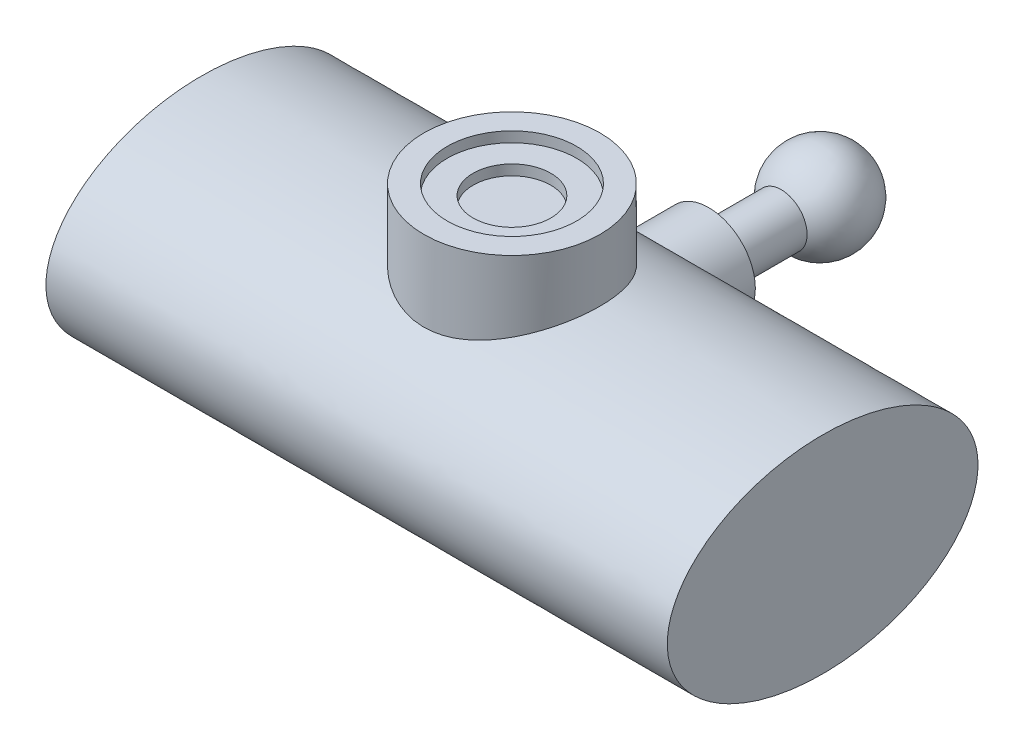
ISO-10303-21;
HEADER;
FILE_DESCRIPTION(('STEP AP214'),'2;1');
FILE_NAME('part.step','',(''),(''),'','','');
FILE_SCHEMA(('AUTOMOTIVE_DESIGN { 1 0 10303 214 1 1 1 1 }'));
ENDSEC;
DATA;
#1=APPLICATION_CONTEXT('core data for automotive mechanical design processes');
#2=APPLICATION_PROTOCOL_DEFINITION('international standard','automotive_design',2000,#1);
#3=PRODUCT_CONTEXT('',#1,'mechanical');
#4=PRODUCT('Part','Part','',(#3));
#5=PRODUCT_RELATED_PRODUCT_CATEGORY('part','',(#4));
#6=PRODUCT_DEFINITION_FORMATION('','',#4);
#7=PRODUCT_DEFINITION_CONTEXT('part definition',#1,'design');
#8=PRODUCT_DEFINITION('design','',#6,#7);
#9=PRODUCT_DEFINITION_SHAPE('','',#8);
#10=(LENGTH_UNIT() NAMED_UNIT(*) SI_UNIT(.MILLI.,.METRE.));
#11=(NAMED_UNIT(*) PLANE_ANGLE_UNIT() SI_UNIT($,.RADIAN.));
#12=(NAMED_UNIT(*) SI_UNIT($,.STERADIAN.) SOLID_ANGLE_UNIT());
#13=UNCERTAINTY_MEASURE_WITH_UNIT(LENGTH_MEASURE(1.E-05),#10,'distance_accuracy_value','');
#14=(GEOMETRIC_REPRESENTATION_CONTEXT(3) GLOBAL_UNCERTAINTY_ASSIGNED_CONTEXT((#13)) GLOBAL_UNIT_ASSIGNED_CONTEXT((#10,
#11,#12)) REPRESENTATION_CONTEXT('',''));
#15=CARTESIAN_POINT('',(0.,0.,0.));
#16=DIRECTION('',(0.,0.,1.));
#17=DIRECTION('',(1.,0.,0.));
#18=AXIS2_PLACEMENT_3D('',#15,#16,#17);
#19=CARTESIAN_POINT('',(-30.,0.,26.));
#20=DIRECTION('',(1.,0.,0.));
#21=DIRECTION('',(0.,0.,-1.));
#22=AXIS2_PLACEMENT_3D('',#19,#20,#21);
#23=ELLIPSE('',#22,15.,10.);
#24=DIRECTION('',(1.,0.,0.));
#25=VECTOR('',#24,1.);
#26=SURFACE_OF_LINEAR_EXTRUSION('',#23,#25);
#27=CARTESIAN_POINT('',(-4.5,0.,11.));
#28=CARTESIAN_POINT('',(-4.50000179661353,0.113427751797759,10.999998104076));
#29=CARTESIAN_POINT('',(-4.49570683559703,0.226836941344397,11.002901009246));
#30=CARTESIAN_POINT('',(-4.47859826356174,0.452757044180179,11.0144232925091));
#31=CARTESIAN_POINT('',(-4.46578222935199,0.565267692732317,11.0230442966921));
#32=CARTESIAN_POINT('',(-4.43180974817744,0.788562805828208,11.0457667567975));
#33=CARTESIAN_POINT('',(-4.41064538078484,0.899345526949475,11.0598734170206));
#34=CARTESIAN_POINT('',(-4.36027244405676,1.11832652619657,11.0931795221124));
#35=CARTESIAN_POINT('',(-4.33106041679894,1.2265236715837,11.1123811560608));
#36=CARTESIAN_POINT('',(-4.26517045877855,1.4389622519027,11.1552431101488));
#37=CARTESIAN_POINT('',(-4.22853884802476,1.54322368635741,11.1788757031795));
#38=CARTESIAN_POINT('',(-4.14810455225398,1.74795320879676,11.2301062680023));
#39=CARTESIAN_POINT('',(-4.10429905696046,1.84841979113998,11.2577057932682));
#40=CARTESIAN_POINT('',(-3.96276861330985,2.14335152297756,11.3455197985101));
#41=CARTESIAN_POINT('',(-3.85486940196405,2.33154018599745,11.4107901373745));
#42=CARTESIAN_POINT('',(-3.60392158054914,2.70501209204091,11.5560344890988));
#43=CARTESIAN_POINT('',(-3.45853379199128,2.88838865227078,11.6368120136786));
#44=CARTESIAN_POINT('',(-3.14178140430147,3.23009476219036,11.8015115384798));
#45=CARTESIAN_POINT('',(-2.9703833618687,3.38839152146735,11.8854374807371));
#46=CARTESIAN_POINT('',(-2.68273694898729,3.61533784930147,12.0139878374257));
#47=CARTESIAN_POINT('',(-2.57435341999766,3.69332312112326,12.0600339860247));
#48=CARTESIAN_POINT('',(-2.35022785291713,3.83983685883343,12.1493942924411));
#49=CARTESIAN_POINT('',(-2.23448450976205,3.90836364064517,12.1927079629995));
#50=CARTESIAN_POINT('',(-1.99631105152499,4.03521042570358,12.2750533001104));
#51=CARTESIAN_POINT('',(-1.87389086705864,4.09354507251045,12.3140910794386));
#52=CARTESIAN_POINT('',(-1.62284749952471,4.1993929358368,12.3864372558138));
#53=CARTESIAN_POINT('',(-1.4942268565902,4.24691053886781,12.4197479739441));
#54=CARTESIAN_POINT('',(-1.26509018908745,4.31973368078795,12.4716061814889));
#55=CARTESIAN_POINT('',(-1.16574768179169,4.34761470798694,12.4917536413799));
#56=CARTESIAN_POINT('',(-0.964612007304901,4.39661582407501,12.5274851960585));
#57=CARTESIAN_POINT('',(-0.862819399121535,4.41773743974061,12.5430703212919));
#58=CARTESIAN_POINT('',(-0.657476723721926,4.45292768238192,12.5691922199446));
#59=CARTESIAN_POINT('',(-0.553928380872625,4.46700285717636,12.5797336797233));
#60=CARTESIAN_POINT('',(-0.345691829615696,4.48792223892815,12.5954464292999));
#61=CARTESIAN_POINT('',(-0.241003597346981,4.49476629422273,12.6006176064634));
#62=CARTESIAN_POINT('',(-0.0310453054331663,4.50112106870681,12.6054180778743));
#63=CARTESIAN_POINT('',(0.0742255277903985,4.50061560625957,12.6050351434851));
#64=CARTESIAN_POINT('',(0.284304014194313,4.49224025645326,12.5987109629353));
#65=CARTESIAN_POINT('',(0.389111666587928,4.48437035659018,12.5927697073373));
#66=CARTESIAN_POINT('',(0.59753363976473,4.46138456087639,12.5755269335715));
#67=CARTESIAN_POINT('',(0.70114731240602,4.44626490329595,12.5642226326772));
#68=CARTESIAN_POINT('',(0.906420191381641,4.40900057668016,12.5366209701257));
#69=CARTESIAN_POINT('',(1.00807936731996,4.38685579848486,12.5203235308826));
#70=CARTESIAN_POINT('',(1.20684557721036,4.33633809787617,12.4835980616951));
#71=CARTESIAN_POINT('',(1.3040029534458,4.30809806452624,12.4632588050804));
#72=CARTESIAN_POINT('',(1.49543340489877,4.24544833923509,12.4187969731321));
#73=CARTESIAN_POINT('',(1.58970548077597,4.21103653735249,12.3946731043083));
#74=CARTESIAN_POINT('',(1.86759038030875,4.09902022836665,12.3175003233271));
#75=CARTESIAN_POINT('',(2.04638550636764,4.01260547275993,12.2596281114524));
#76=CARTESIAN_POINT('',(2.41679295890204,3.80283298823422,12.1257342598217));
#77=CARTESIAN_POINT('',(2.60576432697492,3.67575343801002,12.0482915618635));
#78=CARTESIAN_POINT('',(2.96165670497873,3.39558471419742,11.8894313029242));
#79=CARTESIAN_POINT('',(3.12855059043843,3.24246406449339,11.8080090176696));
#80=CARTESIAN_POINT('',(3.46408364274005,2.88440804907728,11.6343295005055));
#81=CARTESIAN_POINT('',(3.62837513293085,2.67509021151676,11.5425289658539));
#82=CARTESIAN_POINT('',(3.84650148734915,2.33928769412491,11.4151611589783));
#83=CARTESIAN_POINT('',(3.91449348979772,2.22371190570305,11.3744262675036));
#84=CARTESIAN_POINT('',(4.04042479072698,1.98571503458002,11.2975729325259));
#85=CARTESIAN_POINT('',(4.09836705045653,1.86329598241597,11.2614531299735));
#86=CARTESIAN_POINT('',(4.1925136057426,1.63843067480823,11.2019279765487));
#87=CARTESIAN_POINT('',(4.2307339239465,1.53710867483584,11.1774393910207));
#88=CARTESIAN_POINT('',(4.29998446964481,1.33113882007355,11.1326700450054));
#89=CARTESIAN_POINT('',(4.33101618728443,1.22649165968925,11.1123884125382));
#90=CARTESIAN_POINT('',(4.3855094700779,1.01453053362565,11.0765382428872));
#91=CARTESIAN_POINT('',(4.40897647643548,0.907218544834051,11.0609663185684));
#92=CARTESIAN_POINT('',(4.44806119478178,0.690556060860621,11.0349200564462));
#93=CARTESIAN_POINT('',(4.46367877421417,0.581205531285499,11.0244458047293));
#94=CARTESIAN_POINT('',(4.48687763286799,0.360887958636143,11.0088554284552));
#95=CARTESIAN_POINT('',(4.49443095207693,0.249916634964487,11.0037579467049));
#96=CARTESIAN_POINT('',(4.50128932226477,0.0276022757401435,10.9991303202973));
#97=CARTESIAN_POINT('',(4.50059437511811,-0.0837407597280662,10.9996001743749));
#98=CARTESIAN_POINT('',(4.49096626715139,-0.305922193008737,11.0060942616813));
#99=CARTESIAN_POINT('',(4.48203186670135,-0.416760512364704,11.0121193306951));
#100=CARTESIAN_POINT('',(4.45606001427732,-0.637048543935594,11.029553870837));
#101=CARTESIAN_POINT('',(4.43902270985223,-0.746498281398482,11.0409632439203));
#102=CARTESIAN_POINT('',(4.39816713569207,-0.957646057710932,11.0681380131166));
#103=CARTESIAN_POINT('',(4.37474242379664,-1.05945337025825,11.0836493637226));
#104=CARTESIAN_POINT('',(4.32109931219396,-1.2605329468572,11.1188718356031));
#105=CARTESIAN_POINT('',(4.29087858863244,-1.35980433080277,11.1385843933337));
#106=CARTESIAN_POINT('',(4.1905005340399,-1.65296873635818,11.2033829235758));
#107=CARTESIAN_POINT('',(4.11059693349983,-1.84236612863191,11.2541505781957));
#108=CARTESIAN_POINT('',(3.91877250619583,-2.22329796423974,11.3722371155674));
#109=CARTESIAN_POINT('',(3.80451271966262,-2.413288590017,11.4406777339753));
#110=CARTESIAN_POINT('',(3.5511301526749,-2.7727038914783,11.5854144415518));
#111=CARTESIAN_POINT('',(3.41198359303289,-2.94210863515252,11.6617180139171));
#112=CARTESIAN_POINT('',(3.08631648900501,-3.28472085582264,11.829309093388));
#113=CARTESIAN_POINT('',(2.89576699053932,-3.45392474195579,11.9209878613513));
#114=CARTESIAN_POINT('',(2.48696209994966,-3.75899613254762,12.0979294572261));
#115=CARTESIAN_POINT('',(2.26871396155728,-3.89487233765052,12.1831939556316));
#116=CARTESIAN_POINT('',(1.84397141975699,-4.11059794030257,12.3249182480302));
#117=CARTESIAN_POINT('',(1.64110822990307,-4.19591661167427,12.3838018973718));
#118=CARTESIAN_POINT('',(1.32629457494211,-4.30153704143316,12.4585404951784));
#119=CARTESIAN_POINT('',(1.21960759709212,-4.33301685356221,12.4811883078199));
#120=CARTESIAN_POINT('',(1.00328986689162,-4.38814860065665,12.5212587563962));
#121=CARTESIAN_POINT('',(0.893660466169043,-4.41180406545493,12.5386837481917));
#122=CARTESIAN_POINT('',(0.671387824061793,-4.45107495470949,12.5678022585084));
#123=CARTESIAN_POINT('',(0.558728579140754,-4.4666313400165,12.5794536609622));
#124=CARTESIAN_POINT('',(0.332073640419358,-4.48917523480886,12.5963885825209));
#125=CARTESIAN_POINT('',(0.218077954497075,-4.49616279478024,12.6016721391439));
#126=CARTESIAN_POINT('',(-0.0102109097294636,-4.5014364012271,12.6056568556563));
#127=CARTESIAN_POINT('',(-0.124504034273567,-4.49972392396281,12.604359132286));
#128=CARTESIAN_POINT('',(-0.3523605073897,-4.48763387513054,12.5952369613043));
#129=CARTESIAN_POINT('',(-0.465923899310071,-4.47725682315053,12.5874129050571));
#130=CARTESIAN_POINT('',(-0.67923468310089,-4.44959929737168,12.5667252536962));
#131=CARTESIAN_POINT('',(-0.779156752898353,-4.43317928607142,12.5544926666724));
#132=CARTESIAN_POINT('',(-0.977042697073361,-4.39381133925923,12.5254491587045));
#133=CARTESIAN_POINT('',(-1.07500591430874,-4.37086125113962,12.5086367281154));
#134=CARTESIAN_POINT('',(-1.36511414597717,-4.29261252060113,12.4520128996179));
#135=CARTESIAN_POINT('',(-1.55359686105713,-4.22789955962537,12.4060025334264));
#136=CARTESIAN_POINT('',(-1.93310950394273,-4.06927952389765,12.2974236488978));
#137=CARTESIAN_POINT('',(-2.122961598469,-3.97333863531185,12.233770590982));
#138=CARTESIAN_POINT('',(-2.48517306088189,-3.75745013592127,12.0980430526655));
#139=CARTESIAN_POINT('',(-2.65752147832485,-3.63748763474619,12.0259633604053));
#140=CARTESIAN_POINT('',(-3.01530948599678,-3.34969077399854,11.8643378935222));
#141=CARTESIAN_POINT('',(-3.19666612782305,-3.17708160832445,11.7741433128102));
#142=CARTESIAN_POINT('',(-3.4460710098894,-2.89659995275487,11.6422994952934));
#143=CARTESIAN_POINT('',(-3.52549816686507,-2.79941005551074,11.5988871174457));
#144=CARTESIAN_POINT('',(-3.67639443055727,-2.59806555930813,11.5142416740982));
#145=CARTESIAN_POINT('',(-3.74786221934094,-2.49390981148232,11.4730089701066));
#146=CARTESIAN_POINT('',(-3.88653423833227,-2.27222651620535,11.3912915177966));
#147=CARTESIAN_POINT('',(-3.95318017729316,-2.15426984842072,11.3510202467923));
#148=CARTESIAN_POINT('',(-4.076059538743,-1.91160147196229,11.2754448375747));
#149=CARTESIAN_POINT('',(-4.13229869870981,-1.78689353472326,11.2401379649774));
#150=CARTESIAN_POINT('',(-4.23348505678554,-1.53179028546055,11.1757571788904));
#151=CARTESIAN_POINT('',(-4.27846027883129,-1.40141005473585,11.1466678236252));
#152=CARTESIAN_POINT('',(-4.35649158363439,-1.13583379404724,11.0957216245096));
#153=CARTESIAN_POINT('',(-4.38955548718639,-1.0006409882668,11.0738600357939));
#154=CARTESIAN_POINT('',(-4.44399003871495,-0.722290681803393,11.037665045924));
#155=CARTESIAN_POINT('',(-4.4649479028609,-0.579017000181097,11.0235979987963));
#156=CARTESIAN_POINT('',(-4.49295171576239,-0.290485399314258,11.0047667013232));
#157=CARTESIAN_POINT('',(-4.4999976997017,-0.145227485088864,11.0000024274507));
#158=CARTESIAN_POINT('',(-4.5,0.,11.));
#159=B_SPLINE_CURVE_WITH_KNOTS('',3,(#27,#28,#29,#30,#31,#32,#33,#34,#35,#36,#37,#38,#39,#40,
#41,#42,#43,#44,#45,#46,#47,#48,#49,#50,#51,#52,#53,#54,#55,#56,#57,#58,#59,#60,#61,#62,#63,#64,
#65,#66,#67,#68,#69,#70,#71,#72,#73,#74,#75,#76,#77,#78,#79,#80,#81,#82,#83,#84,#85,#86,#87,#88,
#89,#90,#91,#92,#93,#94,#95,#96,#97,#98,#99,#100,#101,#102,#103,#104,#105,#106,#107,#108,#109,
#110,#111,#112,#113,#114,#115,#116,#117,#118,#119,#120,#121,#122,#123,#124,#125,#126,#127,#128,
#129,#130,#131,#132,#133,#134,#135,#136,#137,#138,#139,#140,#141,#142,#143,#144,#145,#146,#147,
#148,#149,#150,#151,#152,#153,#154,#155,#156,#157,#158),.UNSPECIFIED.,.T.,.F.,(4,2,2,2,2,2,2,2,
2,2,2,2,2,2,2,2,2,2,2,2,2,2,2,2,2,2,2,2,2,2,2,2,2,2,2,2,2,2,2,2,2,2,2,2,2,2,2,2,2,2,2,2,2,2,2,2,
2,2,2,2,2,2,2,2,2,4),(0.,0.340133977224594,0.680364721873554,1.02091903766603,1.36161991184411,
1.70025597043293,2.03902500404053,2.71595528338829,3.45599766251007,4.19699975952383,
4.62027501382067,5.04362553499175,5.46636271360192,5.88892815786315,6.20400329255007,
6.51900720958741,6.83371786724526,7.14843512539484,7.46384540997294,7.77925623008434,
8.09483088688747,8.41041044749295,8.71970201041908,9.0290995130492,9.6475397386973,
10.3665098752997,11.086355295658,11.9262098886761,12.3461636741822,12.7659935054501,
13.098739900695,13.4314172581587,13.7638547881668,14.0962979319883,14.4298900002783,
14.7634819927587,15.0971241825146,15.4307602970841,15.7472473454301,16.0638427795728,
16.6965634639746,17.3900897781859,18.0842823283624,18.8932694758549,19.7020452009277,
20.3824710118762,20.7226592902244,21.0626938879199,21.4051736737468,21.7476514417328,
22.0900710985393,22.4324702229634,22.7381204964925,23.0438716430928,23.6550155642333,
24.3187766546416,24.9829504740448,25.7776417863957,26.1757352892663,26.5738946117947,
26.9973185201674,27.4205082858827,27.8426344835977,28.2644830121933,28.699975440192,
29.1354667668091),.UNSPECIFIED.);
#160=CARTESIAN_POINT('',(-4.5,0.,11.));
#161=VERTEX_POINT('',#160);
#162=EDGE_CURVE('E56',#161,#161,#159,.T.);
#163=ORIENTED_EDGE('',*,*,#162,.F.);
#164=EDGE_LOOP('',(#163));
#165=FACE_BOUND('',#164,.T.);
#166=CARTESIAN_POINT('',(30.,0.,26.));
#167=DIRECTION('',(1.,0.,0.));
#168=DIRECTION('',(0.,0.,-1.));
#169=AXIS2_PLACEMENT_3D('',#166,#167,#168);
#170=ELLIPSE('',#169,15.,10.);
#171=CARTESIAN_POINT('',(30.,0.,11.));
#172=VERTEX_POINT('',#171);
#173=EDGE_CURVE('E78',#172,#172,#170,.T.);
#174=ORIENTED_EDGE('',*,*,#173,.F.);
#175=EDGE_LOOP('',(#174));
#176=FACE_BOUND('',#175,.T.);
#177=CARTESIAN_POINT('',(-30.,0.,11.));
#178=VERTEX_POINT('',#177);
#179=EDGE_CURVE('E63',#178,#178,#23,.T.);
#180=ORIENTED_EDGE('',*,*,#179,.T.);
#181=EDGE_LOOP('',(#180));
#182=FACE_BOUND('',#181,.T.);
#183=CARTESIAN_POINT('',(0.,8.23947139620604,17.5000000000004));
#184=CARTESIAN_POINT('',(0.223826071442597,8.23947301211789,17.5000013876241));
#185=CARTESIAN_POINT('',(0.447734459925835,8.243540331611,17.5088535242802));
#186=CARTESIAN_POINT('',(0.893966089108362,8.25966017030362,17.5441750739895));
#187=CARTESIAN_POINT('',(1.11628819945479,8.27171790114709,17.570655985238));
#188=CARTESIAN_POINT('',(1.55814361221104,8.30339845870829,17.6410321665077));
#189=CARTESIAN_POINT('',(1.77766930888649,8.32303865168037,17.6849674192867));
#190=CARTESIAN_POINT('',(2.21190385110959,8.36916437209944,17.7898001768126));
#191=CARTESIAN_POINT('',(2.42661227943886,8.39565048999632,17.8506991446876));
#192=CARTESIAN_POINT('',(2.84895971129045,8.45442909036648,17.9885972503922));
#193=CARTESIAN_POINT('',(3.05662442376914,8.48669694197005,18.0655283079259));
#194=CARTESIAN_POINT('',(3.46463745079335,8.55608395314175,18.2350085304334));
#195=CARTESIAN_POINT('',(3.66498551908996,8.59320327579878,18.3275582204796));
#196=CARTESIAN_POINT('',(4.05724138712297,8.67118252456188,18.5275676759396));
#197=CARTESIAN_POINT('',(4.2491519704762,8.71204120309578,18.6350224746437));
#198=CARTESIAN_POINT('',(4.62366523547322,8.79639340137041,18.8641804841427));
#199=CARTESIAN_POINT('',(4.80626736108067,8.83988707817269,18.9858845446823));
#200=CARTESIAN_POINT('',(5.17412279304689,8.93160126350604,19.2521365718769));
#201=CARTESIAN_POINT('',(5.35861355764531,8.97993618711974,19.397699905987));
#202=CARTESIAN_POINT('',(5.71478351915561,9.07701227934481,19.7034676978128));
#203=CARTESIAN_POINT('',(5.88646760794631,9.12575328485038,19.8636665125237));
#204=CARTESIAN_POINT('',(6.21623688702605,9.22242804891593,20.1979691132443));
#205=CARTESIAN_POINT('',(6.37431205736054,9.27036119213112,20.372082965765));
#206=CARTESIAN_POINT('',(6.67568457052204,9.36416365931079,20.7330747674103));
#207=CARTESIAN_POINT('',(6.81898712184921,9.41003370743954,20.9199481788979));
#208=CARTESIAN_POINT('',(7.09490866869479,9.50023953574686,21.3125762504129));
#209=CARTESIAN_POINT('',(7.22693839073453,9.54445626096369,21.5187731625842));
#210=CARTESIAN_POINT('',(7.47306881870933,9.62832782896457,21.9425039796207));
#211=CARTESIAN_POINT('',(7.58716893244338,9.66798252105662,22.1600382586345));
#212=CARTESIAN_POINT('',(7.79638876307782,9.741681135902,22.6048976341687));
#213=CARTESIAN_POINT('',(7.89151378151209,9.77572662537068,22.8322199743183));
#214=CARTESIAN_POINT('',(8.06188719407887,9.83731895022829,23.2950466490371));
#215=CARTESIAN_POINT('',(8.1371367617531,9.86486616929592,23.5305504996014));
#216=CARTESIAN_POINT('',(8.2639219986207,9.9116038185268,23.9967092150158));
#217=CARTESIAN_POINT('',(8.31640414259958,9.9311255240141,24.2270736745726));
#218=CARTESIAN_POINT('',(8.40205772382955,9.96311671593995,24.6918497569));
#219=CARTESIAN_POINT('',(8.43522970626848,9.97558640147938,24.926261265217));
#220=CARTESIAN_POINT('',(8.48190254292267,9.99315988461634,25.3972434418982));
#221=CARTESIAN_POINT('',(8.49540890147593,9.99826574331895,25.6338134874336));
#222=CARTESIAN_POINT('',(8.50261966991353,10.0009895240807,26.1072952486588));
#223=CARTESIAN_POINT('',(8.49632469124433,9.99860767735297,26.3442069535727));
#224=CARTESIAN_POINT('',(8.46481412424188,9.98672281931004,26.8046661087129));
#225=CARTESIAN_POINT('',(8.44056029386674,9.97758181708727,27.0282894976787));
#226=CARTESIAN_POINT('',(8.37448636563997,9.95280586004161,27.472551528623));
#227=CARTESIAN_POINT('',(8.33266696954687,9.93717116464729,27.6931902894764));
#228=CARTESIAN_POINT('',(8.23185626218885,9.89975769593683,28.1299720279388));
#229=CARTESIAN_POINT('',(8.17286490569716,9.87797890643866,28.3461149937052));
#230=CARTESIAN_POINT('',(8.03823885545271,9.82875863464863,28.7724897815615));
#231=CARTESIAN_POINT('',(7.9626037786335,9.80131702202399,28.9827214674737));
#232=CARTESIAN_POINT('',(7.79445571707964,9.74105771619501,29.3981155831786));
#233=CARTESIAN_POINT('',(7.70177522423072,9.70818703005336,29.603202456198));
#234=CARTESIAN_POINT('',(7.50077383890588,9.63798684395928,30.0048526166814));
#235=CARTESIAN_POINT('',(7.392447323431,9.60065574182192,30.2014128065885));
#236=CARTESIAN_POINT('',(7.16096363447629,9.52235855462546,30.5848394940473));
#237=CARTESIAN_POINT('',(7.03780592483332,9.48139233816727,30.7717056407997));
#238=CARTESIAN_POINT('',(6.77747736058284,9.3967202353108,31.1347542588992));
#239=CARTESIAN_POINT('',(6.64030577359974,9.35301420577402,31.3109361711128));
#240=CARTESIAN_POINT('',(6.34445875758179,9.26124622454769,31.6615774962853));
#241=CARTESIAN_POINT('',(6.18499835495175,9.2130785550557,31.8353474997309));
#242=CARTESIAN_POINT('',(5.85231737203551,9.11597512618356,32.1689446530438));
#243=CARTESIAN_POINT('',(5.67909633736472,9.06703934148264,32.3287713421282));
#244=CARTESIAN_POINT('',(5.31983360978287,8.96966964611511,32.6336180990124));
#245=CARTESIAN_POINT('',(5.13378729848449,8.92123592354001,32.7786327858607));
#246=CARTESIAN_POINT('',(4.74994416385345,8.82622896736984,33.0529199968707));
#247=CARTESIAN_POINT('',(4.55214588951522,8.77965596470861,33.1821905710843));
#248=CARTESIAN_POINT('',(4.13896198559302,8.68822330699745,33.4282409376099));
#249=CARTESIAN_POINT('',(3.9232062432388,8.64347669552495,33.5444424607965));
#250=CARTESIAN_POINT('',(3.48174803788924,8.5590211578781,33.758062305051));
#251=CARTESIAN_POINT('',(3.25604988918073,8.51931007510306,33.8554886764385));
#252=CARTESIAN_POINT('',(2.7962057708535,8.4464043520622,34.030675159956));
#253=CARTESIAN_POINT('',(2.56206283116984,8.41320740156823,34.1084422470556));
#254=CARTESIAN_POINT('',(2.08698839038467,8.35466766771735,34.2435094022696));
#255=CARTESIAN_POINT('',(1.84605746544989,8.32932421993016,34.3008112018724));
#256=CARTESIAN_POINT('',(1.37347997385535,8.28880812441326,34.3915458697071));
#257=CARTESIAN_POINT('',(1.14210517787154,8.27313091405973,34.4261701621131));
#258=CARTESIAN_POINT('',(0.676868157371376,8.25036971048445,34.47623605731));
#259=CARTESIAN_POINT('',(0.443006033268306,8.24328537168733,34.4916784315313));
#260=CARTESIAN_POINT('',(-0.0252185323366505,8.23801104969889,34.50318707568));
#261=CARTESIAN_POINT('',(-0.259580788042708,8.23981819717183,34.4992595963737));
#262=CARTESIAN_POINT('',(-0.726941536740396,8.25224354733433,34.4720919615596));
#263=CARTESIAN_POINT('',(-0.959940072948505,8.26286146926991,34.4488524214276));
#264=CARTESIAN_POINT('',(-1.40708123406717,8.29146060241791,34.3855604477936));
#265=CARTESIAN_POINT('',(-1.62143592745431,8.30889703869859,34.3467473522918));
#266=CARTESIAN_POINT('',(-2.04590803437974,8.35042683362237,34.2529691593179));
#267=CARTESIAN_POINT('',(-2.25602567155111,8.37451983993779,34.1980049167051));
#268=CARTESIAN_POINT('',(-2.67075901894316,8.42856463067372,34.0724220172817));
#269=CARTESIAN_POINT('',(-2.87537440305833,8.45851676148397,34.0018024348991));
#270=CARTESIAN_POINT('',(-3.27802350558709,8.52335992858267,33.8454589748255));
#271=CARTESIAN_POINT('',(-3.47605464862745,8.55825287000843,33.7597292676551));
#272=CARTESIAN_POINT('',(-3.87313407337149,8.63361219403506,33.5696385582736));
#273=CARTESIAN_POINT('',(-4.07183127940065,8.6742581161897,33.464615469693));
#274=CARTESIAN_POINT('',(-4.459867488446,8.7586594551097,33.239469545827));
#275=CARTESIAN_POINT('',(-4.64920326401953,8.80241593176804,33.1193415528607));
#276=CARTESIAN_POINT('',(-5.01752610073787,8.89184750283129,32.8647330818589));
#277=CARTESIAN_POINT('',(-5.19651160446362,8.93752288420033,32.7302504524816));
#278=CARTESIAN_POINT('',(-5.54321427152478,9.02962877149653,32.4476965844847));
#279=CARTESIAN_POINT('',(-5.71093087624955,9.07605931471631,32.2996246730902));
#280=CARTESIAN_POINT('',(-6.04690406443398,9.17218627174215,31.9785520492799));
#281=CARTESIAN_POINT('',(-6.2141729984083,9.22185348135685,31.8045071114903));
#282=CARTESIAN_POINT('',(-6.53347363689901,9.31942173237228,31.4426038627296));
#283=CARTESIAN_POINT('',(-6.68551015940361,9.36732332918411,31.254749952316));
#284=CARTESIAN_POINT('',(-6.97341668183576,9.46015401939145,30.8662044272427));
#285=CARTESIAN_POINT('',(-7.10927956638965,9.50508180066629,30.66550722161));
#286=CARTESIAN_POINT('',(-7.3636610951662,9.5907701211356,30.252675811999));
#287=CARTESIAN_POINT('',(-7.48218720325027,9.63153245135643,30.0405465839033));
#288=CARTESIAN_POINT('',(-7.70058207377071,9.70773655498967,29.6069051357526));
#289=CARTESIAN_POINT('',(-7.80051361819887,9.74319614968836,29.3854277054559));
#290=CARTESIAN_POINT('',(-7.98129555841558,9.8080527548611,28.9339471934475));
#291=CARTESIAN_POINT('',(-8.06214582370228,9.8374497238711,28.7039440534387));
#292=CARTESIAN_POINT('',(-8.20392260790352,9.88940712124127,28.2372114579513));
#293=CARTESIAN_POINT('',(-8.26485651308617,9.91197008386269,28.0004845315682));
#294=CARTESIAN_POINT('',(-8.36618135836584,9.94967828324883,27.5220968116317));
#295=CARTESIAN_POINT('',(-8.40657351459594,9.96482395913716,27.2804363110419));
#296=CARTESIAN_POINT('',(-8.46457256810448,9.98662340900635,26.8087366857814));
#297=CARTESIAN_POINT('',(-8.48339847117776,9.99373116880519,26.5788676489993));
#298=CARTESIAN_POINT('',(-8.50230199998196,10.0008683297942,26.1182546534257));
#299=CARTESIAN_POINT('',(-8.50238041831321,10.0008980302284,25.8875107320348));
#300=CARTESIAN_POINT('',(-8.48379044009783,9.99387907036976,25.4269241220793));
#301=CARTESIAN_POINT('',(-8.46512479226632,9.9868314479277,25.1970813063337));
#302=CARTESIAN_POINT('',(-8.40924333641117,9.96582696300058,24.7399838285081));
#303=CARTESIAN_POINT('',(-8.37202761192846,9.9518701316314,24.5127291547769));
#304=CARTESIAN_POINT('',(-8.28071233298427,9.91785833855255,24.0687487873872));
#305=CARTESIAN_POINT('',(-8.22711222463142,9.89798416778483,23.8519061666721));
#306=CARTESIAN_POINT('',(-8.1032235000665,9.85245734493289,23.4236748088728));
#307=CARTESIAN_POINT('',(-8.03293531372059,9.82680484169291,23.2122859314619));
#308=CARTESIAN_POINT('',(-7.87627478606011,9.7702807239247,22.7963007126436));
#309=CARTESIAN_POINT('',(-7.78990370082315,9.73940951699559,22.5917038422484));
#310=CARTESIAN_POINT('',(-7.60172660557648,9.67309828929428,22.1904213649359));
#311=CARTESIAN_POINT('',(-7.49991472004447,9.63765653011051,21.9937388057694));
#312=CARTESIAN_POINT('',(-7.27769853048999,9.56162402999211,21.602559137086));
#313=CARTESIAN_POINT('',(-7.15675886587803,9.5208943240608,21.4083926858839));
#314=CARTESIAN_POINT('',(-6.89998603102083,9.43627467602131,21.0308582356246));
#315=CARTESIAN_POINT('',(-6.76414730504851,9.39238355715915,20.8474943041757));
#316=CARTESIAN_POINT('',(-6.33564130847865,9.25747047813386,20.3152005668573));
#317=CARTESIAN_POINT('',(-6.02183005895945,9.16315422209205,19.9837987021451));
#318=CARTESIAN_POINT('',(-5.3253452629494,8.96917540014114,19.3575160543847));
#319=CARTESIAN_POINT('',(-4.93971789167204,8.86952272881492,19.06590430464));
#320=CARTESIAN_POINT('',(-4.32712974283205,8.72893543327007,18.6798589051292));
#321=CARTESIAN_POINT('',(-4.1170402885543,8.68351850443579,18.559655106611));
#322=CARTESIAN_POINT('',(-3.68668082745529,8.59714587607496,18.3373009348608));
#323=CARTESIAN_POINT('',(-3.46641547193322,8.55618816646728,18.2351424143289));
#324=CARTESIAN_POINT('',(-3.01718043077527,8.48020445914974,18.049801614867));
#325=CARTESIAN_POINT('',(-2.7882148900074,8.44517567915979,17.9666104287037));
#326=CARTESIAN_POINT('',(-2.32316664584224,8.38239721224071,17.8200068634951));
#327=CARTESIAN_POINT('',(-2.08708749562452,8.35464395631402,17.7565847838464));
#328=CARTESIAN_POINT('',(-1.61019667725078,8.30762092697919,17.6503416575444));
#329=CARTESIAN_POINT('',(-1.36939970743882,8.28832817408678,17.607464778525));
#330=CARTESIAN_POINT('',(-0.884575579297553,8.25898318182936,17.5426214083519));
#331=CARTESIAN_POINT('',(-0.640551156463665,8.24892356944568,17.5206382322718));
#332=CARTESIAN_POINT('',(-0.330086789740515,8.24229173526876,17.5061545111236));
#333=CARTESIAN_POINT('',(-0.264097295331672,8.24123479855962,17.503847161176));
#334=CARTESIAN_POINT('',(-0.132074256140013,8.23982438933111,17.5007696980471));
#335=CARTESIAN_POINT('',(-0.0660407111944533,8.23947091942526,17.4999995905769));
#336=CARTESIAN_POINT('',(0.,8.23947139620604,17.5000000000004));
#337=B_SPLINE_CURVE_WITH_KNOTS('',3,(#183,#184,#185,#186,#187,#188,#189,#190,#191,#192,#193,
#194,#195,#196,#197,#198,#199,#200,#201,#202,#203,#204,#205,#206,#207,#208,#209,#210,#211,#212,
#213,#214,#215,#216,#217,#218,#219,#220,#221,#222,#223,#224,#225,#226,#227,#228,#229,#230,#231,
#232,#233,#234,#235,#236,#237,#238,#239,#240,#241,#242,#243,#244,#245,#246,#247,#248,#249,#250,
#251,#252,#253,#254,#255,#256,#257,#258,#259,#260,#261,#262,#263,#264,#265,#266,#267,#268,#269,
#270,#271,#272,#273,#274,#275,#276,#277,#278,#279,#280,#281,#282,#283,#284,#285,#286,#287,#288,
#289,#290,#291,#292,#293,#294,#295,#296,#297,#298,#299,#300,#301,#302,#303,#304,#305,#306,#307,
#308,#309,#310,#311,#312,#313,#314,#315,#316,#317,#318,#319,#320,#321,#322,#323,#324,#325,#326,
#327,#328,#329,#330,#331,#332,#333,#334,#335,#336),.UNSPECIFIED.,.T.,.F.,(4,2,2,2,2,2,2,2,2,2,2,
2,2,2,2,2,2,2,2,2,2,2,2,2,2,2,2,2,2,2,2,2,2,2,2,2,2,2,2,2,2,2,2,2,2,2,2,2,2,2,2,2,2,2,2,2,2,2,2,
2,2,2,2,2,2,2,2,2,2,2,2,2,2,2,2,2,4),(0.,0.671410570720991,1.34325949201552,2.01665637835719,
2.69011136347735,3.36076276058,4.03143670835756,4.70188770732412,5.37237870854872,
6.09133796208973,6.81002116699239,7.52922907644384,8.24818253544423,8.99366294489334,
9.73916797180717,10.4844644162074,11.2297168448974,11.9400253173362,12.6503137345145,
13.3604033062552,14.0704709513207,14.7450355763115,15.4195732544634,16.0941127091997,
16.7686676905405,17.4502450326633,18.1320679381039,18.8139154995576,19.4957987131156,
20.2171334532797,20.9384920222719,21.6601117235555,22.3818207085592,23.1282082281841,
23.8742749997963,24.6200766997263,25.3658152853203,26.0683101515514,26.7707767649487,
27.4730167030436,28.1752342652285,28.8301020384119,29.4849351565321,30.139806999901,
30.7949320477745,31.4793748390759,32.1640519763187,32.8488318711837,33.5336456862702,
34.2721250681238,35.0103701277461,35.7489387773695,36.4871885151833,37.2228985368026,
37.9586135899891,38.6940554822724,39.4294538291221,40.1208388446942,40.8121946301004,
41.5034490467524,42.1947003503433,42.8666869562712,43.5386562544555,44.2105730936988,
44.8827462547514,45.578997383017,46.2755090254983,47.6675959024789,49.1410904623548,
49.8791526236152,50.6168806991571,51.3542616139952,52.091280127965,52.8262842444023,
53.560700919777,53.7588023588796,53.9569045339663),.UNSPECIFIED.);
#338=CARTESIAN_POINT('',(0.,8.23947139620604,17.5000000000004));
#339=VERTEX_POINT('',#338);
#340=EDGE_CURVE('E42',#339,#339,#337,.T.);
#341=ORIENTED_EDGE('',*,*,#340,.T.);
#342=EDGE_LOOP('',(#341));
#343=FACE_BOUND('',#342,.T.);
#344=ADVANCED_FACE('F38',(#165,#176,#182,#343),#26,.T.);
#345=CARTESIAN_POINT('',(0.,0.,7.));
#346=DIRECTION('',(0.,0.,-1.));
#347=DIRECTION('',(-1.,0.,0.));
#348=AXIS2_PLACEMENT_3D('',#345,#346,#347);
#349=CYLINDRICAL_SURFACE('',#348,2.5);
#350=CARTESIAN_POINT('',(0.,0.,7.));
#351=DIRECTION('',(0.,0.,1.));
#352=DIRECTION('',(1.,0.,0.));
#353=AXIS2_PLACEMENT_3D('',#350,#351,#352);
#354=CIRCLE('',#353,2.5);
#355=CARTESIAN_POINT('',(2.5,0.,7.));
#356=VERTEX_POINT('',#355);
#357=EDGE_CURVE('E10',#356,#356,#354,.T.);
#358=ORIENTED_EDGE('',*,*,#357,.F.);
#359=EDGE_LOOP('',(#358));
#360=FACE_BOUND('',#359,.T.);
#361=CARTESIAN_POINT('',(0.,0.,0.));
#362=DIRECTION('',(0.,0.,1.));
#363=DIRECTION('',(1.,0.,0.));
#364=AXIS2_PLACEMENT_3D('',#361,#362,#363);
#365=CIRCLE('',#364,2.5);
#366=CARTESIAN_POINT('',(2.5,0.,0.));
#367=VERTEX_POINT('',#366);
#368=EDGE_CURVE('E94',#367,#367,#365,.F.);
#369=ORIENTED_EDGE('',*,*,#368,.F.);
#370=EDGE_LOOP('',(#369));
#371=FACE_BOUND('',#370,.T.);
#372=ADVANCED_FACE('F40',(#360,#371),#349,.T.);
#373=CARTESIAN_POINT('',(0.,0.,17.));
#374=DIRECTION('',(0.,0.,-1.));
#375=DIRECTION('',(-1.,0.,0.));
#376=AXIS2_PLACEMENT_3D('',#373,#374,#375);
#377=CYLINDRICAL_SURFACE('',#376,4.5);
#378=ORIENTED_EDGE('',*,*,#162,.T.);
#379=EDGE_LOOP('',(#378));
#380=FACE_BOUND('',#379,.T.);
#381=CARTESIAN_POINT('',(0.,0.,7.));
#382=DIRECTION('',(0.,0.,1.));
#383=DIRECTION('',(1.,0.,0.));
#384=AXIS2_PLACEMENT_3D('',#381,#382,#383);
#385=CIRCLE('',#384,4.5);
#386=CARTESIAN_POINT('',(4.5,0.,7.));
#387=VERTEX_POINT('',#386);
#388=EDGE_CURVE('E51',#387,#387,#385,.T.);
#389=ORIENTED_EDGE('',*,*,#388,.T.);
#390=EDGE_LOOP('',(#389));
#391=FACE_BOUND('',#390,.T.);
#392=ADVANCED_FACE('F64',(#380,#391),#377,.T.);
#393=CARTESIAN_POINT('',(0.,0.,7.));
#394=DIRECTION('',(0.,0.,1.));
#395=DIRECTION('',(1.,0.,0.));
#396=AXIS2_PLACEMENT_3D('',#393,#394,#395);
#397=PLANE('',#396);
#398=ORIENTED_EDGE('',*,*,#357,.T.);
#399=EDGE_LOOP('',(#398));
#400=FACE_BOUND('',#399,.T.);
#401=ORIENTED_EDGE('',*,*,#388,.F.);
#402=EDGE_LOOP('',(#401));
#403=FACE_BOUND('',#402,.T.);
#404=ADVANCED_FACE('F73',(#400,#403),#397,.F.);
#405=CARTESIAN_POINT('',(-30.,0.,26.));
#406=DIRECTION('',(1.,0.,0.));
#407=DIRECTION('',(0.,0.,-1.));
#408=AXIS2_PLACEMENT_3D('',#405,#406,#407);
#409=PLANE('',#408);
#410=ORIENTED_EDGE('',*,*,#179,.F.);
#411=EDGE_LOOP('',(#410));
#412=FACE_BOUND('',#411,.T.);
#413=ADVANCED_FACE('F71',(#412),#409,.F.);
#414=CARTESIAN_POINT('',(30.,0.,26.));
#415=DIRECTION('',(1.,0.,0.));
#416=DIRECTION('',(0.,0.,-1.));
#417=AXIS2_PLACEMENT_3D('',#414,#415,#416);
#418=PLANE('',#417);
#419=ORIENTED_EDGE('',*,*,#173,.T.);
#420=EDGE_LOOP('',(#419));
#421=FACE_BOUND('',#420,.T.);
#422=ADVANCED_FACE('F127',(#421),#418,.T.);
#423=CARTESIAN_POINT('',(0.,16.,26.));
#424=DIRECTION('',(0.,-1.,0.));
#425=DIRECTION('',(0.,0.,-1.));
#426=AXIS2_PLACEMENT_3D('',#423,#424,#425);
#427=CYLINDRICAL_SURFACE('',#426,8.5);
#428=ORIENTED_EDGE('',*,*,#340,.F.);
#429=EDGE_LOOP('',(#428));
#430=FACE_BOUND('',#429,.T.);
#431=CARTESIAN_POINT('',(0.,16.,26.));
#432=DIRECTION('',(0.,1.,0.));
#433=DIRECTION('',(0.,0.,1.));
#434=AXIS2_PLACEMENT_3D('',#431,#432,#433);
#435=CIRCLE('',#434,8.5);
#436=CARTESIAN_POINT('',(0.,16.,34.5));
#437=VERTEX_POINT('',#436);
#438=EDGE_CURVE('E81',#437,#437,#435,.T.);
#439=ORIENTED_EDGE('',*,*,#438,.F.);
#440=EDGE_LOOP('',(#439));
#441=FACE_BOUND('',#440,.T.);
#442=ADVANCED_FACE('F123',(#430,#441),#427,.T.);
#443=CARTESIAN_POINT('',(0.,16.,26.));
#444=DIRECTION('',(0.,1.,0.));
#445=DIRECTION('',(0.,0.,1.));
#446=AXIS2_PLACEMENT_3D('',#443,#444,#445);
#447=PLANE('',#446);
#448=CARTESIAN_POINT('',(0.,16.,26.));
#449=DIRECTION('',(0.,1.,0.));
#450=DIRECTION('',(0.,0.,1.));
#451=AXIS2_PLACEMENT_3D('',#448,#449,#450);
#452=CIRCLE('',#451,6.25);
#453=CARTESIAN_POINT('',(0.,16.,32.25));
#454=VERTEX_POINT('',#453);
#455=EDGE_CURVE('E85',#454,#454,#452,.T.);
#456=ORIENTED_EDGE('',*,*,#455,.F.);
#457=EDGE_LOOP('',(#456));
#458=FACE_BOUND('',#457,.T.);
#459=ORIENTED_EDGE('',*,*,#438,.T.);
#460=EDGE_LOOP('',(#459));
#461=FACE_BOUND('',#460,.T.);
#462=ADVANCED_FACE('F126',(#458,#461),#447,.T.);
#463=CARTESIAN_POINT('',(0.,15.,26.));
#464=DIRECTION('',(0.,1.,0.));
#465=DIRECTION('',(0.,0.,1.));
#466=AXIS2_PLACEMENT_3D('',#463,#464,#465);
#467=CYLINDRICAL_SURFACE('',#466,6.25);
#468=CARTESIAN_POINT('',(0.,15.,26.));
#469=DIRECTION('',(0.,1.,0.));
#470=DIRECTION('',(0.,0.,1.));
#471=AXIS2_PLACEMENT_3D('',#468,#469,#470);
#472=CIRCLE('',#471,6.25);
#473=CARTESIAN_POINT('',(0.,15.,32.25));
#474=VERTEX_POINT('',#473);
#475=EDGE_CURVE('E84',#474,#474,#472,.T.);
#476=ORIENTED_EDGE('',*,*,#475,.F.);
#477=EDGE_LOOP('',(#476));
#478=FACE_BOUND('',#477,.T.);
#479=ORIENTED_EDGE('',*,*,#455,.T.);
#480=EDGE_LOOP('',(#479));
#481=FACE_BOUND('',#480,.T.);
#482=ADVANCED_FACE('F131',(#478,#481),#467,.F.);
#483=CARTESIAN_POINT('',(0.,15.,26.));
#484=DIRECTION('',(0.,1.,0.));
#485=DIRECTION('',(0.,0.,1.));
#486=AXIS2_PLACEMENT_3D('',#483,#484,#485);
#487=PLANE('',#486);
#488=CARTESIAN_POINT('',(0.,15.,26.));
#489=DIRECTION('',(0.,1.,0.));
#490=DIRECTION('',(0.,0.,1.));
#491=AXIS2_PLACEMENT_3D('',#488,#489,#490);
#492=CIRCLE('',#491,3.75);
#493=CARTESIAN_POINT('',(0.,15.,29.75));
#494=VERTEX_POINT('',#493);
#495=EDGE_CURVE('E91',#494,#494,#492,.T.);
#496=ORIENTED_EDGE('',*,*,#495,.F.);
#497=EDGE_LOOP('',(#496));
#498=FACE_BOUND('',#497,.T.);
#499=ORIENTED_EDGE('',*,*,#475,.T.);
#500=EDGE_LOOP('',(#499));
#501=FACE_BOUND('',#500,.T.);
#502=ADVANCED_FACE('F137',(#498,#501),#487,.T.);
#503=CARTESIAN_POINT('',(0.,14.,26.));
#504=DIRECTION('',(0.,1.,0.));
#505=DIRECTION('',(0.,0.,1.));
#506=AXIS2_PLACEMENT_3D('',#503,#504,#505);
#507=CYLINDRICAL_SURFACE('',#506,3.75);
#508=CARTESIAN_POINT('',(0.,14.,26.));
#509=DIRECTION('',(0.,1.,0.));
#510=DIRECTION('',(0.,0.,1.));
#511=AXIS2_PLACEMENT_3D('',#508,#509,#510);
#512=CIRCLE('',#511,3.75);
#513=CARTESIAN_POINT('',(0.,14.,29.75));
#514=VERTEX_POINT('',#513);
#515=EDGE_CURVE('E88',#514,#514,#512,.T.);
#516=ORIENTED_EDGE('',*,*,#515,.F.);
#517=EDGE_LOOP('',(#516));
#518=FACE_BOUND('',#517,.T.);
#519=ORIENTED_EDGE('',*,*,#495,.T.);
#520=EDGE_LOOP('',(#519));
#521=FACE_BOUND('',#520,.T.);
#522=ADVANCED_FACE('F198',(#518,#521),#507,.F.);
#523=CARTESIAN_POINT('',(0.,14.,26.));
#524=DIRECTION('',(0.,1.,0.));
#525=DIRECTION('',(0.,0.,1.));
#526=AXIS2_PLACEMENT_3D('',#523,#524,#525);
#527=PLANE('',#526);
#528=ORIENTED_EDGE('',*,*,#515,.T.);
#529=EDGE_LOOP('',(#528));
#530=FACE_BOUND('',#529,.T.);
#531=ADVANCED_FACE('F207',(#530),#527,.T.);
#532=CARTESIAN_POINT('',(0.,0.,-3.74165738677394));
#533=DIRECTION('',(0.,0.,-1.));
#534=DIRECTION('',(1.,0.,0.));
#535=AXIS2_PLACEMENT_3D('',#532,#533,#534);
#536=SPHERICAL_SURFACE('',#535,4.5);
#537=ORIENTED_EDGE('',*,*,#368,.T.);
#538=EDGE_LOOP('',(#537));
#539=FACE_BOUND('',#538,.T.);
#540=ADVANCED_FACE('F100',(#539),#536,.T.);
#541=CLOSED_SHELL('',(#344,#372,#392,#404,#413,#422,#442,#462,#482,#502,#522,#531,#540));
#542=MANIFOLD_SOLID_BREP('B2',#541);
#543=ADVANCED_BREP_SHAPE_REPRESENTATION('',(#18,#542),#14);
#544=SHAPE_DEFINITION_REPRESENTATION(#9,#543);
ENDSEC;
END-ISO-10303-21;
